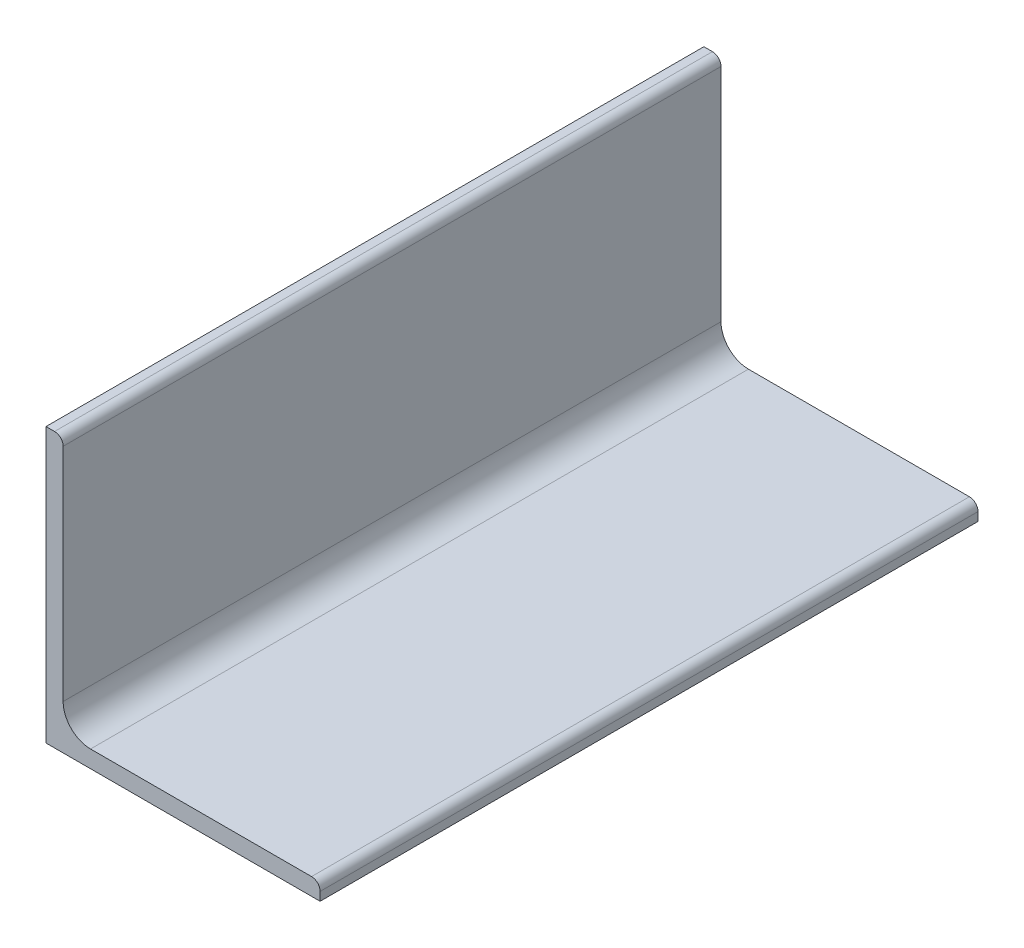
ISO-10303-21;
HEADER;
FILE_DESCRIPTION(('STEP AP214'),'2;1');
FILE_NAME('part.step','',(''),(''),'','','');
FILE_SCHEMA(('AUTOMOTIVE_DESIGN { 1 0 10303 214 1 1 1 1 }'));
ENDSEC;
DATA;
#1=APPLICATION_CONTEXT('core data for automotive mechanical design processes');
#2=APPLICATION_PROTOCOL_DEFINITION('international standard','automotive_design',2000,#1);
#3=PRODUCT_CONTEXT('',#1,'mechanical');
#4=PRODUCT('Part','Part','',(#3));
#5=PRODUCT_RELATED_PRODUCT_CATEGORY('part','',(#4));
#6=PRODUCT_DEFINITION_FORMATION('','',#4);
#7=PRODUCT_DEFINITION_CONTEXT('part definition',#1,'design');
#8=PRODUCT_DEFINITION('design','',#6,#7);
#9=PRODUCT_DEFINITION_SHAPE('','',#8);
#10=(LENGTH_UNIT() NAMED_UNIT(*) SI_UNIT(.MILLI.,.METRE.));
#11=(NAMED_UNIT(*) PLANE_ANGLE_UNIT() SI_UNIT($,.RADIAN.));
#12=(NAMED_UNIT(*) SI_UNIT($,.STERADIAN.) SOLID_ANGLE_UNIT());
#13=UNCERTAINTY_MEASURE_WITH_UNIT(LENGTH_MEASURE(1.E-05),#10,'distance_accuracy_value','');
#14=(GEOMETRIC_REPRESENTATION_CONTEXT(3) GLOBAL_UNCERTAINTY_ASSIGNED_CONTEXT((#13)) GLOBAL_UNIT_ASSIGNED_CONTEXT((#10,
#11,#12)) REPRESENTATION_CONTEXT('',''));
#15=CARTESIAN_POINT('',(0.,0.,0.));
#16=DIRECTION('',(0.,0.,1.));
#17=DIRECTION('',(1.,0.,0.));
#18=AXIS2_PLACEMENT_3D('',#15,#16,#17);
#19=CARTESIAN_POINT('',(0.0507450451214936,127.041655270204,304.8));
#20=DIRECTION('',(1.,0.,0.));
#21=DIRECTION('',(0.,0.,-1.));
#22=AXIS2_PLACEMENT_3D('',#19,#20,#21);
#23=PLANE('',#22);
#24=DIRECTION('',(0.,-1.,0.));
#25=VECTOR('',#24,1.);
#26=CARTESIAN_POINT('',(0.0507450451214936,127.041655270204,0.));
#27=LINE('',#26,#25);
#28=CARTESIAN_POINT('',(0.0507450451214936,127.041655270204,0.));
#29=VERTEX_POINT('',#28);
#30=CARTESIAN_POINT('',(0.0507450451214936,0.0416552702040917,0.));
#31=VERTEX_POINT('',#30);
#32=EDGE_CURVE('E135',#29,#31,#27,.T.);
#33=ORIENTED_EDGE('',*,*,#32,.T.);
#34=DIRECTION('',(0.,0.,-1.));
#35=VECTOR('',#34,1.);
#36=CARTESIAN_POINT('',(0.0507450451214936,0.0416552702040917,304.8));
#37=LINE('',#36,#35);
#38=CARTESIAN_POINT('',(0.0507450451214936,0.0416552702040917,304.8));
#39=VERTEX_POINT('',#38);
#40=EDGE_CURVE('E11',#39,#31,#37,.T.);
#41=ORIENTED_EDGE('',*,*,#40,.F.);
#42=DIRECTION('',(0.,-1.,0.));
#43=VECTOR('',#42,1.);
#44=CARTESIAN_POINT('',(0.0507450451214936,127.041655270204,304.8));
#45=LINE('',#44,#43);
#46=CARTESIAN_POINT('',(0.0507450451214936,127.041655270204,304.8));
#47=VERTEX_POINT('',#46);
#48=EDGE_CURVE('E151',#47,#39,#45,.T.);
#49=ORIENTED_EDGE('',*,*,#48,.F.);
#50=DIRECTION('',(0.,0.,-1.));
#51=VECTOR('',#50,1.);
#52=CARTESIAN_POINT('',(0.0507450451214936,127.041655270204,304.8));
#53=LINE('',#52,#51);
#54=EDGE_CURVE('E131',#47,#29,#53,.T.);
#55=ORIENTED_EDGE('',*,*,#54,.T.);
#56=EDGE_LOOP('',(#33,#41,#49,#55));
#57=FACE_BOUND('',#56,.T.);
#58=ADVANCED_FACE('F33',(#57),#23,.F.);
#59=CARTESIAN_POINT('',(0.0507450451214936,0.0416552702040917,304.8));
#60=DIRECTION('',(0.,1.,0.));
#61=DIRECTION('',(0.,0.,1.));
#62=AXIS2_PLACEMENT_3D('',#59,#60,#61);
#63=PLANE('',#62);
#64=DIRECTION('',(1.,0.,0.));
#65=VECTOR('',#64,1.);
#66=CARTESIAN_POINT('',(0.0507450451214936,0.0416552702040917,0.));
#67=LINE('',#66,#65);
#68=CARTESIAN_POINT('',(127.050745045121,0.0416552702040917,0.));
#69=VERTEX_POINT('',#68);
#70=EDGE_CURVE('E138',#31,#69,#67,.T.);
#71=ORIENTED_EDGE('',*,*,#70,.T.);
#72=DIRECTION('',(0.,0.,-1.));
#73=VECTOR('',#72,1.);
#74=CARTESIAN_POINT('',(127.050745045121,0.0416552702040917,304.8));
#75=LINE('',#74,#73);
#76=CARTESIAN_POINT('',(127.050745045121,0.0416552702040917,304.8));
#77=VERTEX_POINT('',#76);
#78=EDGE_CURVE('E41',#77,#69,#75,.T.);
#79=ORIENTED_EDGE('',*,*,#78,.F.);
#80=DIRECTION('',(1.,0.,0.));
#81=VECTOR('',#80,1.);
#82=CARTESIAN_POINT('',(0.0507450451214936,0.0416552702040917,304.8));
#83=LINE('',#82,#81);
#84=EDGE_CURVE('E95',#39,#77,#83,.T.);
#85=ORIENTED_EDGE('',*,*,#84,.F.);
#86=ORIENTED_EDGE('',*,*,#40,.T.);
#87=EDGE_LOOP('',(#71,#79,#85,#86));
#88=FACE_BOUND('',#87,.T.);
#89=ADVANCED_FACE('F194',(#88),#63,.F.);
#90=CARTESIAN_POINT('',(127.050745045121,0.0416552702040917,304.8));
#91=DIRECTION('',(-1.,0.,0.));
#92=DIRECTION('',(0.,0.,1.));
#93=AXIS2_PLACEMENT_3D('',#90,#91,#92);
#94=PLANE('',#93);
#95=DIRECTION('',(0.,1.,0.));
#96=VECTOR('',#95,1.);
#97=CARTESIAN_POINT('',(127.050745045121,0.0416552702040917,0.));
#98=LINE('',#97,#96);
#99=CARTESIAN_POINT('',(127.050745045121,4.01040527020409,0.));
#100=VERTEX_POINT('',#99);
#101=EDGE_CURVE('E140',#69,#100,#98,.T.);
#102=ORIENTED_EDGE('',*,*,#101,.T.);
#103=DIRECTION('',(0.,0.,-1.));
#104=VECTOR('',#103,1.);
#105=CARTESIAN_POINT('',(127.050745045121,4.01040527020409,304.8));
#106=LINE('',#105,#104);
#107=CARTESIAN_POINT('',(127.050745045121,4.01040527020409,304.8));
#108=VERTEX_POINT('',#107);
#109=EDGE_CURVE('E161',#108,#100,#106,.T.);
#110=ORIENTED_EDGE('',*,*,#109,.F.);
#111=DIRECTION('',(0.,1.,0.));
#112=VECTOR('',#111,1.);
#113=CARTESIAN_POINT('',(127.050745045121,0.0416552702040917,304.8));
#114=LINE('',#113,#112);
#115=EDGE_CURVE('E169',#77,#108,#114,.T.);
#116=ORIENTED_EDGE('',*,*,#115,.F.);
#117=ORIENTED_EDGE('',*,*,#78,.T.);
#118=EDGE_LOOP('',(#102,#110,#116,#117));
#119=FACE_BOUND('',#118,.T.);
#120=ADVANCED_FACE('F167',(#119),#94,.F.);
#121=CARTESIAN_POINT('',(123.081995045121,4.01040527020409,304.8));
#122=DIRECTION('',(0.,0.,-1.));
#123=DIRECTION('',(-1.,0.,0.));
#124=AXIS2_PLACEMENT_3D('',#121,#122,#123);
#125=CYLINDRICAL_SURFACE('',#124,3.96875);
#126=CARTESIAN_POINT('',(123.081995045121,4.01040527020409,0.));
#127=DIRECTION('',(0.,0.,1.));
#128=DIRECTION('',(1.,0.,0.));
#129=AXIS2_PLACEMENT_3D('',#126,#127,#128);
#130=CIRCLE('',#129,3.96875);
#131=CARTESIAN_POINT('',(123.081995045121,7.97915527020409,0.));
#132=VERTEX_POINT('',#131);
#133=EDGE_CURVE('E142',#100,#132,#130,.T.);
#134=ORIENTED_EDGE('',*,*,#133,.T.);
#135=DIRECTION('',(0.,0.,-1.));
#136=VECTOR('',#135,1.);
#137=CARTESIAN_POINT('',(123.081995045121,7.97915527020409,304.8));
#138=LINE('',#137,#136);
#139=CARTESIAN_POINT('',(123.081995045121,7.97915527020409,304.8));
#140=VERTEX_POINT('',#139);
#141=EDGE_CURVE('E158',#140,#132,#138,.T.);
#142=ORIENTED_EDGE('',*,*,#141,.F.);
#143=CARTESIAN_POINT('',(123.081995045121,4.01040527020409,304.8));
#144=DIRECTION('',(0.,0.,1.));
#145=DIRECTION('',(1.,0.,0.));
#146=AXIS2_PLACEMENT_3D('',#143,#144,#145);
#147=CIRCLE('',#146,3.96875);
#148=EDGE_CURVE('E185',#108,#140,#147,.T.);
#149=ORIENTED_EDGE('',*,*,#148,.F.);
#150=ORIENTED_EDGE('',*,*,#109,.T.);
#151=EDGE_LOOP('',(#134,#142,#149,#150));
#152=FACE_BOUND('',#151,.T.);
#153=ADVANCED_FACE('F178',(#152),#125,.T.);
#154=CARTESIAN_POINT('',(123.081995045121,7.97915527020409,304.8));
#155=DIRECTION('',(0.,-1.,0.));
#156=DIRECTION('',(0.,0.,-1.));
#157=AXIS2_PLACEMENT_3D('',#154,#155,#156);
#158=PLANE('',#157);
#159=DIRECTION('',(-1.,0.,0.));
#160=VECTOR('',#159,1.);
#161=CARTESIAN_POINT('',(123.081995045121,7.97915527020409,0.));
#162=LINE('',#161,#160);
#163=CARTESIAN_POINT('',(20.6882450451215,7.97915527020409,0.));
#164=VERTEX_POINT('',#163);
#165=EDGE_CURVE('E144',#132,#164,#162,.T.);
#166=ORIENTED_EDGE('',*,*,#165,.T.);
#167=DIRECTION('',(0.,0.,-1.));
#168=VECTOR('',#167,1.);
#169=CARTESIAN_POINT('',(20.6882450451215,7.97915527020409,304.8));
#170=LINE('',#169,#168);
#171=CARTESIAN_POINT('',(20.6882450451215,7.97915527020409,304.8));
#172=VERTEX_POINT('',#171);
#173=EDGE_CURVE('E155',#172,#164,#170,.T.);
#174=ORIENTED_EDGE('',*,*,#173,.F.);
#175=DIRECTION('',(-1.,0.,0.));
#176=VECTOR('',#175,1.);
#177=CARTESIAN_POINT('',(123.081995045121,7.97915527020409,304.8));
#178=LINE('',#177,#176);
#179=EDGE_CURVE('E184',#140,#172,#178,.T.);
#180=ORIENTED_EDGE('',*,*,#179,.F.);
#181=ORIENTED_EDGE('',*,*,#141,.T.);
#182=EDGE_LOOP('',(#166,#174,#180,#181));
#183=FACE_BOUND('',#182,.T.);
#184=ADVANCED_FACE('F182',(#183),#158,.F.);
#185=CARTESIAN_POINT('',(20.6882450451215,20.6791552702041,304.8));
#186=DIRECTION('',(0.,0.,-1.));
#187=DIRECTION('',(-1.,0.,0.));
#188=AXIS2_PLACEMENT_3D('',#185,#186,#187);
#189=CYLINDRICAL_SURFACE('',#188,12.7);
#190=CARTESIAN_POINT('',(20.6882450451215,20.6791552702041,0.));
#191=DIRECTION('',(0.,0.,-1.));
#192=DIRECTION('',(1.,0.,0.));
#193=AXIS2_PLACEMENT_3D('',#190,#191,#192);
#194=CIRCLE('',#193,12.7);
#195=CARTESIAN_POINT('',(7.98824504512149,20.6791552702041,0.));
#196=VERTEX_POINT('',#195);
#197=EDGE_CURVE('E146',#164,#196,#194,.T.);
#198=ORIENTED_EDGE('',*,*,#197,.T.);
#199=DIRECTION('',(0.,0.,-1.));
#200=VECTOR('',#199,1.);
#201=CARTESIAN_POINT('',(7.98824504512149,20.6791552702041,304.8));
#202=LINE('',#201,#200);
#203=CARTESIAN_POINT('',(7.98824504512149,20.6791552702041,304.8));
#204=VERTEX_POINT('',#203);
#205=EDGE_CURVE('E126',#204,#196,#202,.T.);
#206=ORIENTED_EDGE('',*,*,#205,.F.);
#207=CARTESIAN_POINT('',(20.6882450451215,20.6791552702041,304.8));
#208=DIRECTION('',(0.,0.,-1.));
#209=DIRECTION('',(1.,0.,0.));
#210=AXIS2_PLACEMENT_3D('',#207,#208,#209);
#211=CIRCLE('',#210,12.7);
#212=EDGE_CURVE('E117',#172,#204,#211,.T.);
#213=ORIENTED_EDGE('',*,*,#212,.F.);
#214=ORIENTED_EDGE('',*,*,#173,.T.);
#215=EDGE_LOOP('',(#198,#206,#213,#214));
#216=FACE_BOUND('',#215,.T.);
#217=ADVANCED_FACE('F206',(#216),#189,.F.);
#218=CARTESIAN_POINT('',(7.98824504512149,20.6791552702041,304.8));
#219=DIRECTION('',(-1.,0.,0.));
#220=DIRECTION('',(0.,0.,1.));
#221=AXIS2_PLACEMENT_3D('',#218,#219,#220);
#222=PLANE('',#221);
#223=DIRECTION('',(0.,1.,0.));
#224=VECTOR('',#223,1.);
#225=CARTESIAN_POINT('',(7.98824504512149,20.6791552702041,0.));
#226=LINE('',#225,#224);
#227=CARTESIAN_POINT('',(7.98824504512149,123.072905270204,0.));
#228=VERTEX_POINT('',#227);
#229=EDGE_CURVE('E125',#196,#228,#226,.T.);
#230=ORIENTED_EDGE('',*,*,#229,.T.);
#231=DIRECTION('',(0.,0.,-1.));
#232=VECTOR('',#231,1.);
#233=CARTESIAN_POINT('',(7.98824504512149,123.072905270204,304.8));
#234=LINE('',#233,#232);
#235=CARTESIAN_POINT('',(7.98824504512149,123.072905270204,304.8));
#236=VERTEX_POINT('',#235);
#237=EDGE_CURVE('E122',#236,#228,#234,.T.);
#238=ORIENTED_EDGE('',*,*,#237,.F.);
#239=DIRECTION('',(0.,1.,0.));
#240=VECTOR('',#239,1.);
#241=CARTESIAN_POINT('',(7.98824504512149,20.6791552702041,304.8));
#242=LINE('',#241,#240);
#243=EDGE_CURVE('E111',#204,#236,#242,.T.);
#244=ORIENTED_EDGE('',*,*,#243,.F.);
#245=ORIENTED_EDGE('',*,*,#205,.T.);
#246=EDGE_LOOP('',(#230,#238,#244,#245));
#247=FACE_BOUND('',#246,.T.);
#248=ADVANCED_FACE('F123',(#247),#222,.F.);
#249=CARTESIAN_POINT('',(4.0194950451215,123.072905270204,304.8));
#250=DIRECTION('',(0.,0.,-1.));
#251=DIRECTION('',(-1.,0.,0.));
#252=AXIS2_PLACEMENT_3D('',#249,#250,#251);
#253=CYLINDRICAL_SURFACE('',#252,3.96875);
#254=CARTESIAN_POINT('',(4.0194950451215,123.072905270204,0.));
#255=DIRECTION('',(0.,0.,1.));
#256=DIRECTION('',(1.,0.,0.));
#257=AXIS2_PLACEMENT_3D('',#254,#255,#256);
#258=CIRCLE('',#257,3.96875);
#259=CARTESIAN_POINT('',(4.01949504512149,127.041655270204,0.));
#260=VERTEX_POINT('',#259);
#261=EDGE_CURVE('E81',#228,#260,#258,.T.);
#262=ORIENTED_EDGE('',*,*,#261,.T.);
#263=DIRECTION('',(0.,0.,-1.));
#264=VECTOR('',#263,1.);
#265=CARTESIAN_POINT('',(4.01949504512149,127.041655270204,304.8));
#266=LINE('',#265,#264);
#267=CARTESIAN_POINT('',(4.01949504512149,127.041655270204,304.8));
#268=VERTEX_POINT('',#267);
#269=EDGE_CURVE('E127',#268,#260,#266,.T.);
#270=ORIENTED_EDGE('',*,*,#269,.F.);
#271=CARTESIAN_POINT('',(4.0194950451215,123.072905270204,304.8));
#272=DIRECTION('',(0.,0.,1.));
#273=DIRECTION('',(1.,0.,0.));
#274=AXIS2_PLACEMENT_3D('',#271,#272,#273);
#275=CIRCLE('',#274,3.96875);
#276=EDGE_CURVE('E115',#236,#268,#275,.T.);
#277=ORIENTED_EDGE('',*,*,#276,.F.);
#278=ORIENTED_EDGE('',*,*,#237,.T.);
#279=EDGE_LOOP('',(#262,#270,#277,#278));
#280=FACE_BOUND('',#279,.T.);
#281=ADVANCED_FACE('F129',(#280),#253,.T.);
#282=CARTESIAN_POINT('',(4.01949504512149,127.041655270204,304.8));
#283=DIRECTION('',(0.,-1.,0.));
#284=DIRECTION('',(0.,0.,-1.));
#285=AXIS2_PLACEMENT_3D('',#282,#283,#284);
#286=PLANE('',#285);
#287=DIRECTION('',(-1.,0.,0.));
#288=VECTOR('',#287,1.);
#289=CARTESIAN_POINT('',(4.01949504512149,127.041655270204,0.));
#290=LINE('',#289,#288);
#291=EDGE_CURVE('E87',#260,#29,#290,.T.);
#292=ORIENTED_EDGE('',*,*,#291,.T.);
#293=ORIENTED_EDGE('',*,*,#54,.F.);
#294=DIRECTION('',(-1.,0.,0.));
#295=VECTOR('',#294,1.);
#296=CARTESIAN_POINT('',(4.01949504512149,127.041655270204,304.8));
#297=LINE('',#296,#295);
#298=EDGE_CURVE('E49',#268,#47,#297,.T.);
#299=ORIENTED_EDGE('',*,*,#298,.F.);
#300=ORIENTED_EDGE('',*,*,#269,.T.);
#301=EDGE_LOOP('',(#292,#293,#299,#300));
#302=FACE_BOUND('',#301,.T.);
#303=ADVANCED_FACE('F214',(#302),#286,.F.);
#304=CARTESIAN_POINT('',(123.081995045121,4.01040527020409,304.8));
#305=DIRECTION('',(0.,0.,1.));
#306=DIRECTION('',(1.,0.,0.));
#307=AXIS2_PLACEMENT_3D('',#304,#305,#306);
#308=PLANE('',#307);
#309=ORIENTED_EDGE('',*,*,#48,.T.);
#310=ORIENTED_EDGE('',*,*,#84,.T.);
#311=ORIENTED_EDGE('',*,*,#115,.T.);
#312=ORIENTED_EDGE('',*,*,#148,.T.);
#313=ORIENTED_EDGE('',*,*,#179,.T.);
#314=ORIENTED_EDGE('',*,*,#212,.T.);
#315=ORIENTED_EDGE('',*,*,#243,.T.);
#316=ORIENTED_EDGE('',*,*,#276,.T.);
#317=ORIENTED_EDGE('',*,*,#298,.T.);
#318=EDGE_LOOP('',(#309,#310,#311,#312,#313,#314,#315,#316,#317));
#319=FACE_BOUND('',#318,.T.);
#320=ADVANCED_FACE('F113',(#319),#308,.T.);
#321=CARTESIAN_POINT('',(123.081995045121,4.01040527020409,0.));
#322=DIRECTION('',(0.,0.,1.));
#323=DIRECTION('',(1.,0.,0.));
#324=AXIS2_PLACEMENT_3D('',#321,#322,#323);
#325=PLANE('',#324);
#326=ORIENTED_EDGE('',*,*,#32,.F.);
#327=ORIENTED_EDGE('',*,*,#291,.F.);
#328=ORIENTED_EDGE('',*,*,#261,.F.);
#329=ORIENTED_EDGE('',*,*,#229,.F.);
#330=ORIENTED_EDGE('',*,*,#197,.F.);
#331=ORIENTED_EDGE('',*,*,#165,.F.);
#332=ORIENTED_EDGE('',*,*,#133,.F.);
#333=ORIENTED_EDGE('',*,*,#101,.F.);
#334=ORIENTED_EDGE('',*,*,#70,.F.);
#335=EDGE_LOOP('',(#326,#327,#328,#329,#330,#331,#332,#333,#334));
#336=FACE_BOUND('',#335,.T.);
#337=ADVANCED_FACE('F173',(#336),#325,.F.);
#338=CLOSED_SHELL('',(#58,#89,#120,#153,#184,#217,#248,#281,#303,#320,#337));
#339=MANIFOLD_SOLID_BREP('B2',#338);
#340=ADVANCED_BREP_SHAPE_REPRESENTATION('',(#18,#339),#14);
#341=SHAPE_DEFINITION_REPRESENTATION(#9,#340);
ENDSEC;
END-ISO-10303-21;
